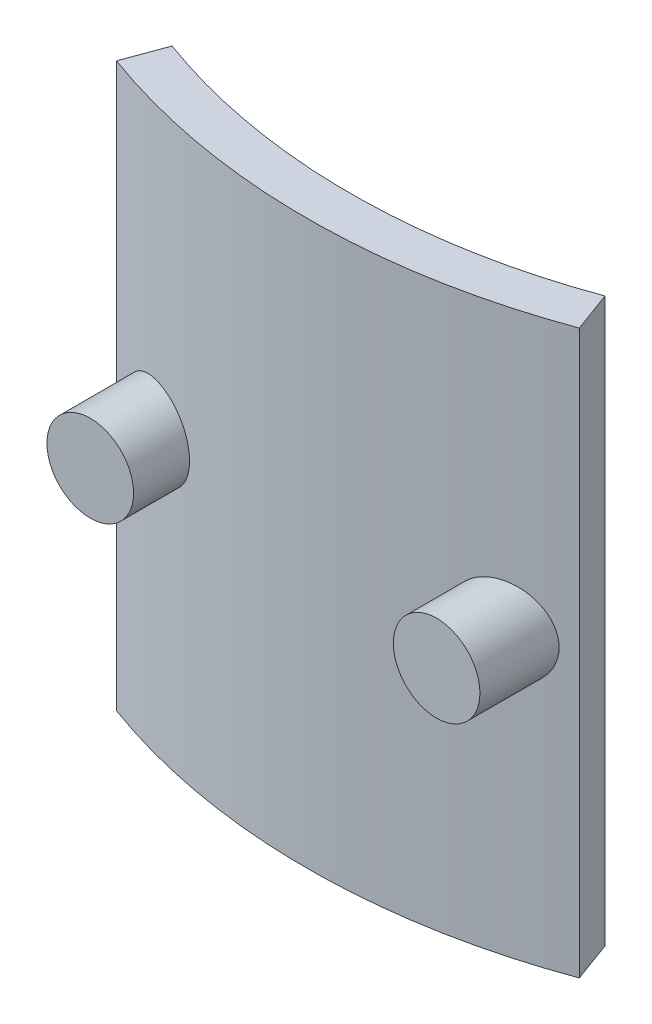
ISO-10303-21;
HEADER;
FILE_DESCRIPTION(('STEP AP214'),'2;1');
FILE_NAME('part.step','',(''),(''),'','','');
FILE_SCHEMA(('AUTOMOTIVE_DESIGN { 1 0 10303 214 1 1 1 1 }'));
ENDSEC;
DATA;
#1=APPLICATION_CONTEXT('core data for automotive mechanical design processes');
#2=APPLICATION_PROTOCOL_DEFINITION('international standard','automotive_design',2000,#1);
#3=PRODUCT_CONTEXT('',#1,'mechanical');
#4=PRODUCT('Part','Part','',(#3));
#5=PRODUCT_RELATED_PRODUCT_CATEGORY('part','',(#4));
#6=PRODUCT_DEFINITION_FORMATION('','',#4);
#7=PRODUCT_DEFINITION_CONTEXT('part definition',#1,'design');
#8=PRODUCT_DEFINITION('design','',#6,#7);
#9=PRODUCT_DEFINITION_SHAPE('','',#8);
#10=(LENGTH_UNIT() NAMED_UNIT(*) SI_UNIT(.MILLI.,.METRE.));
#11=(NAMED_UNIT(*) PLANE_ANGLE_UNIT() SI_UNIT($,.RADIAN.));
#12=(NAMED_UNIT(*) SI_UNIT($,.STERADIAN.) SOLID_ANGLE_UNIT());
#13=UNCERTAINTY_MEASURE_WITH_UNIT(LENGTH_MEASURE(1.E-05),#10,'distance_accuracy_value','');
#14=(GEOMETRIC_REPRESENTATION_CONTEXT(3) GLOBAL_UNCERTAINTY_ASSIGNED_CONTEXT((#13)) GLOBAL_UNIT_ASSIGNED_CONTEXT((#10,
#11,#12)) REPRESENTATION_CONTEXT('',''));
#15=CARTESIAN_POINT('',(0.,0.,0.));
#16=DIRECTION('',(0.,0.,1.));
#17=DIRECTION('',(1.,0.,0.));
#18=AXIS2_PLACEMENT_3D('',#15,#16,#17);
#19=CARTESIAN_POINT('',(0.,32.5,-72.5));
#20=DIRECTION('',(0.,-1.,0.));
#21=DIRECTION('',(0.,0.,-1.));
#22=AXIS2_PLACEMENT_3D('',#19,#20,#21);
#23=CYLINDRICAL_SURFACE('',#22,77.5);
#24=CARTESIAN_POINT('',(0.,-32.5,-72.5));
#25=DIRECTION('',(0.,1.,0.));
#26=DIRECTION('',(0.,0.,-1.));
#27=AXIS2_PLACEMENT_3D('',#24,#25,#26);
#28=CIRCLE('',#27,77.5);
#29=CARTESIAN_POINT('',(-26.7241379310345,-32.5,0.246618147121097));
#30=VERTEX_POINT('',#29);
#31=CARTESIAN_POINT('',(26.7241379310345,-32.5,0.246618147121083));
#32=VERTEX_POINT('',#31);
#33=EDGE_CURVE('E79',#30,#32,#28,.T.);
#34=ORIENTED_EDGE('',*,*,#33,.T.);
#35=DIRECTION('',(0.,-1.,0.));
#36=VECTOR('',#35,1.);
#37=CARTESIAN_POINT('',(26.7241379310345,32.5,0.246618147121083));
#38=LINE('',#37,#36);
#39=CARTESIAN_POINT('',(26.7241379310345,32.5,0.246618147121083));
#40=VERTEX_POINT('',#39);
#41=EDGE_CURVE('E107',#40,#32,#38,.T.);
#42=ORIENTED_EDGE('',*,*,#41,.F.);
#43=CARTESIAN_POINT('',(0.,32.5,-72.5));
#44=DIRECTION('',(0.,1.,0.));
#45=DIRECTION('',(0.,0.,-1.));
#46=AXIS2_PLACEMENT_3D('',#43,#44,#45);
#47=CIRCLE('',#46,77.5);
#48=CARTESIAN_POINT('',(-26.7241379310345,32.5,0.246618147121097));
#49=VERTEX_POINT('',#48);
#50=EDGE_CURVE('E96',#49,#40,#47,.T.);
#51=ORIENTED_EDGE('',*,*,#50,.F.);
#52=DIRECTION('',(0.,-1.,0.));
#53=VECTOR('',#52,1.);
#54=CARTESIAN_POINT('',(-26.7241379310345,32.5,0.246618147121097));
#55=LINE('',#54,#53);
#56=EDGE_CURVE('E102',#49,#30,#55,.T.);
#57=ORIENTED_EDGE('',*,*,#56,.T.);
#58=EDGE_LOOP('',(#34,#42,#51,#57));
#59=FACE_BOUND('',#58,.T.);
#60=CARTESIAN_POINT('',(-25.,0.,0.857003755606073));
#61=CARTESIAN_POINT('',(-25.0000012408049,-0.135252625132453,0.857003211021999));
#62=CARTESIAN_POINT('',(-24.9945087230892,-0.270488190350179,0.858875833438647));
#63=CARTESIAN_POINT('',(-24.9725916465428,-0.540011791240107,0.866339724952005));
#64=CARTESIAN_POINT('',(-24.9561641697617,-0.674299564328976,0.871931986619385));
#65=CARTESIAN_POINT('',(-24.9125106250282,-0.941020160222908,0.886765453114799));
#66=CARTESIAN_POINT('',(-24.8852751717758,-1.07345126700484,0.896009829290666));
#67=CARTESIAN_POINT('',(-24.82024913496,-1.33544846809279,0.918025104004591));
#68=CARTESIAN_POINT('',(-24.7824545675556,-1.46501346109477,0.930797333543373));
#69=CARTESIAN_POINT('',(-24.6967509575378,-1.72005524991855,0.959666007768892));
#70=CARTESIAN_POINT('',(-24.6488638633655,-1.84554024593692,0.975755237273817));
#71=CARTESIAN_POINT('',(-24.5433252888435,-2.09192830542884,1.011075895364));
#72=CARTESIAN_POINT('',(-24.4856702071338,-2.21282965876624,1.03030848278148));
#73=CARTESIAN_POINT('',(-24.3611221177703,-2.44917265412048,1.07166594168789));
#74=CARTESIAN_POINT('',(-24.2942340191346,-2.56461715394371,1.09378927589057));
#75=CARTESIAN_POINT('',(-24.151704526268,-2.78945812497952,1.14068711621359));
#76=CARTESIAN_POINT('',(-24.0760598247015,-2.89885228779843,1.16546262378207));
#77=CARTESIAN_POINT('',(-23.9145932797421,-3.11359095190591,1.21804126519764));
#78=CARTESIAN_POINT('',(-23.8285633180388,-3.2187643946932,1.24590487562253));
#79=CARTESIAN_POINT('',(-23.6485659215811,-3.4214568631518,1.30382301020202));
#80=CARTESIAN_POINT('',(-23.5545955989613,-3.51897307883914,1.33387833092041));
#81=CARTESIAN_POINT('',(-23.261795398066,-3.7991492705385,1.42686025362789));
#82=CARTESIAN_POINT('',(-23.0519496854026,-3.96960430509207,1.49264432604669));
#83=CARTESIAN_POINT('',(-22.598032076417,-4.28132812126077,1.6325705714127));
#84=CARTESIAN_POINT('',(-22.3527906608894,-4.42076995983216,1.70696382001012));
#85=CARTESIAN_POINT('',(-21.843090863087,-4.65637597000732,1.85859092369962));
#86=CARTESIAN_POINT('',(-21.5786285640638,-4.75253129199151,1.9358253561634));
#87=CARTESIAN_POINT('',(-21.0283761197109,-4.90167055617173,2.09317596301666));
#88=CARTESIAN_POINT('',(-20.7421689113301,-4.95310885659203,2.17330239056535));
#89=CARTESIAN_POINT('',(-20.16454750957,-5.00569957276501,2.33134821154762));
#90=CARTESIAN_POINT('',(-19.8731330584127,-5.00684949211774,2.40926749522299));
#91=CARTESIAN_POINT('',(-19.2923519385777,-4.95826895322651,2.56094550048348));
#92=CARTESIAN_POINT('',(-19.0029958830546,-4.90836194551541,2.63468884848188));
#93=CARTESIAN_POINT('',(-18.436031648493,-4.75814828424736,2.77581350257045));
#94=CARTESIAN_POINT('',(-18.1584223073509,-4.65784662893649,2.84319543881152));
#95=CARTESIAN_POINT('',(-17.6292571303561,-4.41168438136,2.96874715416472));
#96=CARTESIAN_POINT('',(-17.3772800586727,-4.26681284937828,3.02707914129293));
#97=CARTESIAN_POINT('',(-16.9010204780856,-3.9345379701315,3.135079193222));
#98=CARTESIAN_POINT('',(-16.67673359482,-3.74714135408232,3.184748627004));
#99=CARTESIAN_POINT('',(-16.2691654263119,-3.34085740784061,3.2733900321137));
#100=CARTESIAN_POINT('',(-16.084903811414,-3.12301060613984,3.31262482270069));
#101=CARTESIAN_POINT('',(-15.7555604558213,-2.65816372386,3.38175488644412));
#102=CARTESIAN_POINT('',(-15.6104735633668,-2.41116748278863,3.41165138773437));
#103=CARTESIAN_POINT('',(-15.3670914809103,-1.90110669230993,3.46129046976207));
#104=CARTESIAN_POINT('',(-15.2678104629131,-1.63853309534235,3.48124779303446));
#105=CARTESIAN_POINT('',(-15.1144702796128,-1.09998407410739,3.51190013480908));
#106=CARTESIAN_POINT('',(-15.0604074540257,-0.824009736505684,3.52259590301032));
#107=CARTESIAN_POINT('',(-14.9996431521848,-0.270256418864549,3.53460832431681));
#108=CARTESIAN_POINT('',(-14.9923489952359,0.00745514730484493,3.53604234950751));
#109=CARTESIAN_POINT('',(-15.0237729990046,0.560153843636413,3.52983949308688));
#110=CARTESIAN_POINT('',(-15.0624895615733,0.835141068092092,3.52220292653597));
#111=CARTESIAN_POINT('',(-15.1845038986508,1.37367404688867,3.49792530314415));
#112=CARTESIAN_POINT('',(-15.2676564981725,1.63725405498915,3.48131356673884));
#113=CARTESIAN_POINT('',(-15.475839744597,2.14654538372624,3.43918353252248));
#114=CARTESIAN_POINT('',(-15.6008706577504,2.39225659074594,3.41366517808561));
#115=CARTESIAN_POINT('',(-15.8897381011471,2.86038684004746,3.35372776155381));
#116=CARTESIAN_POINT('',(-16.0537859335319,3.08266919371609,3.3192601367133));
#117=CARTESIAN_POINT('',(-16.4152680096262,3.49645320145336,3.24181842932915));
#118=CARTESIAN_POINT('',(-16.6127040678534,3.68795318151808,3.19884388444645));
#119=CARTESIAN_POINT('',(-17.0382133356927,4.03792324745313,3.10421545460493));
#120=CARTESIAN_POINT('',(-17.2666983483091,4.19586001470751,3.05244204462165));
#121=CARTESIAN_POINT('',(-17.7452216665024,4.47126511805982,2.94148318713454));
#122=CARTESIAN_POINT('',(-17.9952622796116,4.58872911479572,2.88229694577747));
#123=CARTESIAN_POINT('',(-18.5159790744418,4.78296262355903,2.75610881861424));
#124=CARTESIAN_POINT('',(-18.7870054742614,4.85869322055031,2.68895403066273));
#125=CARTESIAN_POINT('',(-19.3366295307687,4.96369215222336,2.54948463935504));
#126=CARTESIAN_POINT('',(-19.615228342098,4.99295336036714,2.47716924634593));
#127=CARTESIAN_POINT('',(-20.1802091971157,5.00495721640669,2.32711378983185));
#128=CARTESIAN_POINT('',(-20.4665930476554,4.9863887061514,2.24927894564289));
#129=CARTESIAN_POINT('',(-21.0318008956494,4.90071479113567,2.09221997577527));
#130=CARTESIAN_POINT('',(-21.3106237984485,4.8336023968253,2.01299565163654));
#131=CARTESIAN_POINT('',(-21.7197473137362,4.69720637147237,1.89437791838178));
#132=CARTESIAN_POINT('',(-21.8558640114504,4.64510820695119,1.85449350388178));
#133=CARTESIAN_POINT('',(-22.123181183089,4.52916012155075,1.77539441851349));
#134=CARTESIAN_POINT('',(-22.2543834486706,4.46531453462642,1.73617950645847));
#135=CARTESIAN_POINT('',(-22.5109844266876,4.32623078027981,1.65877269550599));
#136=CARTESIAN_POINT('',(-22.6363807587035,4.25098799310092,1.62058121887104));
#137=CARTESIAN_POINT('',(-22.8803470787209,4.08961833823957,1.54563452203213));
#138=CARTESIAN_POINT('',(-22.9989198136797,4.00349589560016,1.5088787258118));
#139=CARTESIAN_POINT('',(-23.2276254588509,3.82147278680606,1.43741731678123));
#140=CARTESIAN_POINT('',(-23.3378085654436,3.72563986699339,1.40269985159406));
#141=CARTESIAN_POINT('',(-23.5496678139561,3.52437179699512,1.33546230961817));
#142=CARTESIAN_POINT('',(-23.6513475103743,3.418940697813,1.30294131579032));
#143=CARTESIAN_POINT('',(-23.8454504900397,3.19906653598908,1.24045629899677));
#144=CARTESIAN_POINT('',(-23.9378688764326,3.08461876236857,1.21049362995366));
#145=CARTESIAN_POINT('',(-24.1125303334074,2.8475876204436,1.15354247036479));
#146=CARTESIAN_POINT('',(-24.1947779933604,2.72500796016592,1.12655263898072));
#147=CARTESIAN_POINT('',(-24.3455221250375,2.47723231482609,1.07684159213265));
#148=CARTESIAN_POINT('',(-24.4144155589555,2.35230211468995,1.0539991602067));
#149=CARTESIAN_POINT('',(-24.5414366604348,2.0965978650251,1.01171585683752));
#150=CARTESIAN_POINT('',(-24.5995691375176,1.96582645877373,0.992273465989596));
#151=CARTESIAN_POINT('',(-24.7044793026861,1.69950881347675,0.957074295069395));
#152=CARTESIAN_POINT('',(-24.7512708127,1.56396861963418,0.941313029446714));
#153=CARTESIAN_POINT('',(-24.8331050512915,1.2890542154943,0.913682357783325));
#154=CARTESIAN_POINT('',(-24.8681517188486,1.14968130761349,0.90181164695973));
#155=CARTESIAN_POINT('',(-24.9312611702461,0.843342579008581,0.880402909943525));
#156=CARTESIAN_POINT('',(-24.9570077374475,0.675839229699985,0.87164363121982));
#157=CARTESIAN_POINT('',(-24.9913761305346,0.338881626250357,0.859944478274738));
#158=CARTESIAN_POINT('',(-24.9999984456761,0.169427427986036,0.857004437792306));
#159=CARTESIAN_POINT('',(-25.,0.,0.857003755606073));
#160=B_SPLINE_CURVE_WITH_KNOTS('',3,(#60,#61,#62,#63,#64,#65,#66,#67,#68,#69,#70,#71,#72,#73,
#74,#75,#76,#77,#78,#79,#80,#81,#82,#83,#84,#85,#86,#87,#88,#89,#90,#91,#92,#93,#94,#95,#96,#97,
#98,#99,#100,#101,#102,#103,#104,#105,#106,#107,#108,#109,#110,#111,#112,#113,#114,#115,#116,
#117,#118,#119,#120,#121,#122,#123,#124,#125,#126,#127,#128,#129,#130,#131,#132,#133,#134,#135,
#136,#137,#138,#139,#140,#141,#142,#143,#144,#145,#146,#147,#148,#149,#150,#151,#152,#153,#154,
#155,#156,#157,#158,#159),.UNSPECIFIED.,.T.,.F.,(4,2,2,2,2,2,2,2,2,2,2,2,2,2,2,2,2,2,2,2,2,2,2,
2,2,2,2,2,2,2,2,2,2,2,2,2,2,2,2,2,2,2,2,2,2,2,2,2,2,4),(0.,0.405604396196098,0.811317069728037,
1.21738282477711,1.62360199147433,2.0289466954784,2.43444117257928,2.83972088054658,
3.24515416364761,3.6607847408421,4.07656713663017,4.90749725125008,5.77891736050586,
6.65051554456939,7.55116272153882,8.45185460810068,9.3556715541026,10.2593988753486,
11.1443642905829,12.0291897238889,12.8889902111166,13.7486775732249,14.5888838511594,
15.4290221102008,16.2584922328262,17.0879335452527,17.9146814470757,18.7414346052293,
19.5727714318644,20.4041534528905,21.2478942645455,22.0917255112837,22.9557101157345,
23.8198272079342,24.7078828961014,25.5960664756723,26.0489371693911,26.5016411201445,
26.9545290640222,27.4072333959257,27.856972343862,28.3065223474772,28.7563088071306,
29.2058915617388,29.6387948189411,30.0715041239407,30.5036833775336,30.935717541666,
31.4438220834701,31.9519121080448),.UNSPECIFIED.);
#161=CARTESIAN_POINT('',(-25.,0.,0.857003755606073));
#162=VERTEX_POINT('',#161);
#163=EDGE_CURVE('E54',#162,#162,#160,.T.);
#164=ORIENTED_EDGE('',*,*,#163,.F.);
#165=EDGE_LOOP('',(#164));
#166=FACE_BOUND('',#165,.T.);
#167=CARTESIAN_POINT('',(15.,0.,3.53453162872776));
#168=CARTESIAN_POINT('',(14.9999988610372,-0.138322868000786,3.53453172963872));
#169=CARTESIAN_POINT('',(15.0057426386028,-0.276628337894224,3.53339937070697));
#170=CARTESIAN_POINT('',(15.0286723088931,-0.552295397962366,3.52887050175651));
#171=CARTESIAN_POINT('',(15.0458611645974,-0.689656734407243,3.5254734054269));
#172=CARTESIAN_POINT('',(15.0915683563441,-0.962524721518199,3.51641339510785));
#173=CARTESIAN_POINT('',(15.1200964509413,-1.09802967039588,3.51074852944484));
#174=CARTESIAN_POINT('',(15.1882674432878,-1.36615165317041,3.49715612704595));
#175=CARTESIAN_POINT('',(15.2279144242401,-1.49876760682063,3.48922775906192));
#176=CARTESIAN_POINT('',(15.3179534670919,-1.75997234839337,3.4711287645155));
#177=CARTESIAN_POINT('',(15.3683332746171,-1.88856553893481,3.46096069472248));
#178=CARTESIAN_POINT('',(15.4794887406951,-2.14102974336778,3.43838715414971));
#179=CARTESIAN_POINT('',(15.5402682179387,-2.26489900215805,3.42598086141782));
#180=CARTESIAN_POINT('',(15.6716945646719,-2.50693522303179,3.39896234383782));
#181=CARTESIAN_POINT('',(15.7423353834116,-2.62510562246357,3.38435147124092));
#182=CARTESIAN_POINT('',(15.8929930492108,-2.85506495633039,3.35294122558002));
#183=CARTESIAN_POINT('',(15.9730133716763,-2.96685150238175,3.33614104104662));
#184=CARTESIAN_POINT('',(16.1423110677762,-3.18391202797733,3.30028577121827));
#185=CARTESIAN_POINT('',(16.2316419929773,-3.28914206315232,3.28121754103527));
#186=CARTESIAN_POINT('',(16.4185010894299,-3.49168408811633,3.24095297106827));
#187=CARTESIAN_POINT('',(16.5160322520369,-3.58899316272742,3.21975585413679));
#188=CARTESIAN_POINT('',(16.7184975934085,-3.77500124177508,3.17531020165948));
#189=CARTESIAN_POINT('',(16.8234296542212,-3.86370269237297,3.15206225253679));
#190=CARTESIAN_POINT('',(17.0399817315629,-4.03201007995788,3.10358018541808));
#191=CARTESIAN_POINT('',(17.151604232393,-4.11161260602696,3.07834532853683));
#192=CARTESIAN_POINT('',(17.3827161526523,-4.26253523994648,3.02552861149296));
#193=CARTESIAN_POINT('',(17.5023097462613,-4.33368409374694,2.99791315234125));
#194=CARTESIAN_POINT('',(17.7467041071819,-4.46564148499217,2.94083940102175));
#195=CARTESIAN_POINT('',(17.8715067768081,-4.52644620295582,2.91138043362287));
#196=CARTESIAN_POINT('',(18.1253561413638,-4.63733541333515,2.85076952476919));
#197=CARTESIAN_POINT('',(18.2544016790923,-4.68742280127229,2.8196180434433));
#198=CARTESIAN_POINT('',(18.5158650719805,-4.77665788121943,2.75576999558152));
#199=CARTESIAN_POINT('',(18.6482841737461,-4.81580146335128,2.72307285395716));
#200=CARTESIAN_POINT('',(19.0561207112666,-4.91821355448094,2.62119335925874));
#201=CARTESIAN_POINT('',(19.3356815702474,-4.96365194821705,2.54975317431348));
#202=CARTESIAN_POINT('',(19.897256753549,-5.00688547108404,2.40282783229287));
#203=CARTESIAN_POINT('',(20.1792714494234,-5.00467325502973,2.32734205339141));
#204=CARTESIAN_POINT('',(20.7458504893629,-4.95244487959623,2.17227148605463));
#205=CARTESIAN_POINT('',(21.0302845610362,-4.90116426483849,2.09263108541531));
#206=CARTESIAN_POINT('',(21.5862102352804,-4.7504653898235,1.93365643226373));
#207=CARTESIAN_POINT('',(21.8577002295373,-4.65104116470966,1.85432221891521));
#208=CARTESIAN_POINT('',(22.3833687391245,-4.40508081341408,1.69778253804118));
#209=CARTESIAN_POINT('',(22.6373040532001,-4.25800049148821,1.62061342581374));
#210=CARTESIAN_POINT('',(23.1167736158861,-3.92066628125844,1.472480189855));
#211=CARTESIAN_POINT('',(23.3423090471384,-3.73041419165948,1.40151580778093));
#212=CARTESIAN_POINT('',(23.7540882576426,-3.31523500773459,1.27017874436837));
#213=CARTESIAN_POINT('',(23.9409563606572,-3.09098062966211,1.20964094635897));
#214=CARTESIAN_POINT('',(24.2738695028166,-2.61135538928811,1.10067969342299));
#215=CARTESIAN_POINT('',(24.4199264889956,-2.35599366484121,1.0522526936217));
#216=CARTESIAN_POINT('',(24.6600645955432,-1.83374829670594,0.972080331641991));
#217=CARTESIAN_POINT('',(24.7562008876844,-1.56791096754832,0.939678544994852));
#218=CARTESIAN_POINT('',(24.9024578543035,-1.02251589878464,0.890214910758276));
#219=CARTESIAN_POINT('',(24.9525934472799,-0.742962638402559,0.87314808991942));
#220=CARTESIAN_POINT('',(25.0036274894312,-0.191825432940502,0.855772007940681));
#221=CARTESIAN_POINT('',(25.0066714758071,0.0795388233664345,0.854732533650385));
#222=CARTESIAN_POINT('',(24.9689137347216,0.618816180889628,0.867593249259809));
#223=CARTESIAN_POINT('',(24.9281168344789,0.886729658776392,0.88149179436879));
#224=CARTESIAN_POINT('',(24.8050918114606,1.40775559988164,0.92316739780555));
#225=CARTESIAN_POINT('',(24.7234440717422,1.66102144571163,0.950749996655262));
#226=CARTESIAN_POINT('',(24.5218707494397,2.15003534498707,1.01829085295935));
#227=CARTESIAN_POINT('',(24.4019413290691,2.38578163915292,1.05825035120156));
#228=CARTESIAN_POINT('',(24.1240107546738,2.83994215902143,1.1498743726373));
#229=CARTESIAN_POINT('',(23.9650890160462,3.05773537823435,1.20181977923486));
#230=CARTESIAN_POINT('',(23.6157814062813,3.46379846421318,1.31448701380471));
#231=CARTESIAN_POINT('',(23.4253886010853,3.65206180676935,1.3752107755521));
#232=CARTESIAN_POINT('',(23.0086229651858,4.00324064992581,1.50610198898529));
#233=CARTESIAN_POINT('',(22.780965807172,4.1645155925804,1.57658200245819));
#234=CARTESIAN_POINT('',(22.3030925016298,4.44666035050601,1.72185927861741));
#235=CARTESIAN_POINT('',(22.0528713674793,4.56752120637067,1.79665749430268));
#236=CARTESIAN_POINT('',(21.5259683882039,4.77014618207851,1.95106464169921));
#237=CARTESIAN_POINT('',(21.2486265272555,4.85013817536811,2.03074596026523));
#238=CARTESIAN_POINT('',(20.6839504343135,4.96134215460745,2.18942355216254));
#239=CARTESIAN_POINT('',(20.3966151461081,4.99254896830668,2.2684197519741));
#240=CARTESIAN_POINT('',(19.9626033848409,5.00199952438798,2.38502882716532));
#241=CARTESIAN_POINT('',(19.8164313340136,4.99877124559549,2.42384049329196));
#242=CARTESIAN_POINT('',(19.5246709541934,4.97949783429706,2.5003992773508));
#243=CARTESIAN_POINT('',(19.3790824252556,4.96345755200394,2.53814679253886));
#244=CARTESIAN_POINT('',(19.0895052590796,4.91858557329291,2.61233692827173));
#245=CARTESIAN_POINT('',(18.9455172104669,4.8897493205693,2.64877907901123));
#246=CARTESIAN_POINT('',(18.6603299803034,4.81942326689056,2.7201015348747));
#247=CARTESIAN_POINT('',(18.5191296837463,4.77793863868589,2.75498247180622));
#248=CARTESIAN_POINT('',(18.242601035565,4.68322496165177,2.82248980999751));
#249=CARTESIAN_POINT('',(18.1072169861869,4.63017671182547,2.85514173872067));
#250=CARTESIAN_POINT('',(17.8412724823159,4.51232089099919,2.91854994831005));
#251=CARTESIAN_POINT('',(17.7107100747004,4.44751814574692,2.94930700019192));
#252=CARTESIAN_POINT('',(17.4553593583011,4.30651608285156,3.00879169178483));
#253=CARTESIAN_POINT('',(17.3305725065477,4.2303139097126,3.03751882034865));
#254=CARTESIAN_POINT('',(17.0878766880029,4.06705257676035,3.09279036693486));
#255=CARTESIAN_POINT('',(16.9699648714915,3.97999796294763,3.11933569121699));
#256=CARTESIAN_POINT('',(16.7450882288924,3.79814183303127,3.1694451370488));
#257=CARTESIAN_POINT('',(16.6379114750848,3.70361935001037,3.19307118596722));
#258=CARTESIAN_POINT('',(16.4318465673898,3.50552390105911,3.23807192209133));
#259=CARTESIAN_POINT('',(16.3329549940242,3.4019547053184,3.25944753904443));
#260=CARTESIAN_POINT('',(16.1441719459393,3.18639720761444,3.2999013172815));
#261=CARTESIAN_POINT('',(16.0542853102529,3.07440443501984,3.31897824441059));
#262=CARTESIAN_POINT('',(15.8843541744234,2.8428978765024,3.35476143345451));
#263=CARTESIAN_POINT('',(15.8043057126244,2.72338714742907,3.37146865002951));
#264=CARTESIAN_POINT('',(15.6565060431811,2.48067629876623,3.40210390785987));
#265=CARTESIAN_POINT('',(15.5885029197423,2.35763680872728,3.4160897019528));
#266=CARTESIAN_POINT('',(15.4630419124439,2.10612283004867,3.44174369341636));
#267=CARTESIAN_POINT('',(15.4055798300023,1.97765053054113,3.4534128136899));
#268=CARTESIAN_POINT('',(15.3016866142548,1.7162773360871,3.47441145664365));
#269=CARTESIAN_POINT('',(15.2552448751554,1.58338084055505,3.4837432292324));
#270=CARTESIAN_POINT('',(15.1737130905282,1.31405843856338,3.50006682014855));
#271=CARTESIAN_POINT('',(15.1386199347181,1.17763351022264,3.50705927962474));
#272=CARTESIAN_POINT('',(15.0730494640159,0.869245259242008,3.52009320149569));
#273=CARTESIAN_POINT('',(15.0456826566787,0.696584826356679,3.52550740424611));
#274=CARTESIAN_POINT('',(15.0091587223918,0.349273674860522,3.53272653854887));
#275=CARTESIAN_POINT('',(15.0000014378611,0.174622973486161,3.53453150133471));
#276=CARTESIAN_POINT('',(15.,0.,3.53453162872776));
#277=B_SPLINE_CURVE_WITH_KNOTS('',3,(#167,#168,#169,#170,#171,#172,#173,#174,#175,#176,#177,
#178,#179,#180,#181,#182,#183,#184,#185,#186,#187,#188,#189,#190,#191,#192,#193,#194,#195,#196,
#197,#198,#199,#200,#201,#202,#203,#204,#205,#206,#207,#208,#209,#210,#211,#212,#213,#214,#215,
#216,#217,#218,#219,#220,#221,#222,#223,#224,#225,#226,#227,#228,#229,#230,#231,#232,#233,#234,
#235,#236,#237,#238,#239,#240,#241,#242,#243,#244,#245,#246,#247,#248,#249,#250,#251,#252,#253,
#254,#255,#256,#257,#258,#259,#260,#261,#262,#263,#264,#265,#266,#267,#268,#269,#270,#271,#272,
#273,#274,#275,#276),.UNSPECIFIED.,.T.,.F.,(4,2,2,2,2,2,2,2,2,2,2,2,2,2,2,2,2,2,2,2,2,2,2,2,2,2,
2,2,2,2,2,2,2,2,2,2,2,2,2,2,2,2,2,2,2,2,2,2,2,2,2,2,2,2,4),(0.,0.414814933054206,
0.829737297993405,1.24501752116552,1.66045044837667,2.07541156654219,2.49052538399536,
2.90538560519356,3.32040003420775,3.73794911417736,4.15565117781424,4.57323418682909,
4.99097322552091,5.41609557701148,5.84137456208001,6.2665385032322,6.69186189823892,
7.56381505533045,8.4359026221022,9.33108595975171,10.2263802364638,11.1322813721767,
12.038144771428,12.9279882893542,13.8175710411906,14.6668468050716,15.5158470426613,
16.3260459271805,17.1361556117142,17.935069358385,18.7340632223326,19.554127287744,
20.3743722803138,21.2338018845499,22.0934218897737,22.9876887911427,23.8820504970989,
24.3354125020833,24.7886029600796,25.2419549168272,25.6951217163476,26.1416552274301,
26.5880058296945,27.0344684282076,27.4807446316064,27.9147426069199,28.3485605700528,
28.7826104197366,29.2164849086563,29.6397976432653,30.0629414011444,30.4856762658468,
30.9082951741106,31.4319746275325,31.9556495491368),.UNSPECIFIED.);
#278=CARTESIAN_POINT('',(15.,0.,3.53453162872776));
#279=VERTEX_POINT('',#278);
#280=EDGE_CURVE('E11',#279,#279,#277,.T.);
#281=ORIENTED_EDGE('',*,*,#280,.F.);
#282=EDGE_LOOP('',(#281));
#283=FACE_BOUND('',#282,.T.);
#284=ADVANCED_FACE('F39',(#59,#166,#283),#23,.T.);
#285=CARTESIAN_POINT('',(0.,32.5,-72.5));
#286=DIRECTION('',(0.,-1.,0.));
#287=DIRECTION('',(0.,0.,-1.));
#288=AXIS2_PLACEMENT_3D('',#285,#286,#287);
#289=CYLINDRICAL_SURFACE('',#288,72.5);
#290=CARTESIAN_POINT('',(0.,-32.5,-72.5));
#291=DIRECTION('',(0.,-1.,0.));
#292=DIRECTION('',(0.,0.,-1.));
#293=AXIS2_PLACEMENT_3D('',#290,#291,#292);
#294=CIRCLE('',#293,72.5);
#295=CARTESIAN_POINT('',(25.,-32.5,-4.446712055919));
#296=VERTEX_POINT('',#295);
#297=CARTESIAN_POINT('',(-25.,-32.5,-4.446712055919));
#298=VERTEX_POINT('',#297);
#299=EDGE_CURVE('E117',#296,#298,#294,.T.);
#300=ORIENTED_EDGE('',*,*,#299,.T.);
#301=DIRECTION('',(0.,-1.,0.));
#302=VECTOR('',#301,1.);
#303=CARTESIAN_POINT('',(-25.,32.5,-4.446712055919));
#304=LINE('',#303,#302);
#305=CARTESIAN_POINT('',(-25.,32.5,-4.446712055919));
#306=VERTEX_POINT('',#305);
#307=EDGE_CURVE('E106',#306,#298,#304,.T.);
#308=ORIENTED_EDGE('',*,*,#307,.F.);
#309=CARTESIAN_POINT('',(0.,32.5,-72.5));
#310=DIRECTION('',(0.,-1.,0.));
#311=DIRECTION('',(0.,0.,-1.));
#312=AXIS2_PLACEMENT_3D('',#309,#310,#311);
#313=CIRCLE('',#312,72.5);
#314=CARTESIAN_POINT('',(25.,32.5,-4.446712055919));
#315=VERTEX_POINT('',#314);
#316=EDGE_CURVE('E98',#315,#306,#313,.T.);
#317=ORIENTED_EDGE('',*,*,#316,.F.);
#318=DIRECTION('',(0.,-1.,0.));
#319=VECTOR('',#318,1.);
#320=CARTESIAN_POINT('',(25.,32.5,-4.446712055919));
#321=LINE('',#320,#319);
#322=EDGE_CURVE('E113',#315,#296,#321,.T.);
#323=ORIENTED_EDGE('',*,*,#322,.T.);
#324=EDGE_LOOP('',(#300,#308,#317,#323));
#325=FACE_BOUND('',#324,.T.);
#326=ADVANCED_FACE('F41',(#325),#289,.F.);
#327=CARTESIAN_POINT('',(-25.,32.5,-4.446712055919));
#328=DIRECTION('',(0.938666040608013,0.,0.344827586206899));
#329=DIRECTION('',(0.344827586206899,0.,-0.938666040608013));
#330=AXIS2_PLACEMENT_3D('',#327,#328,#329);
#331=PLANE('',#330);
#332=DIRECTION('',(-0.344827586206898,0.,0.938666040608013));
#333=VECTOR('',#332,1.);
#334=CARTESIAN_POINT('',(-25.,-32.5,-4.446712055919));
#335=LINE('',#334,#333);
#336=EDGE_CURVE('E104',#298,#30,#335,.T.);
#337=ORIENTED_EDGE('',*,*,#336,.T.);
#338=ORIENTED_EDGE('',*,*,#56,.F.);
#339=DIRECTION('',(-0.344827586206898,0.,0.938666040608013));
#340=VECTOR('',#339,1.);
#341=CARTESIAN_POINT('',(-25.,32.5,-4.446712055919));
#342=LINE('',#341,#340);
#343=EDGE_CURVE('E93',#306,#49,#342,.T.);
#344=ORIENTED_EDGE('',*,*,#343,.F.);
#345=ORIENTED_EDGE('',*,*,#307,.T.);
#346=EDGE_LOOP('',(#337,#338,#344,#345));
#347=FACE_BOUND('',#346,.T.);
#348=ADVANCED_FACE('F103',(#347),#331,.F.);
#349=CARTESIAN_POINT('',(25.,32.5,-4.446712055919));
#350=DIRECTION('',(-0.938666040608015,0.,0.344827586206893));
#351=DIRECTION('',(0.344827586206893,0.,0.938666040608015));
#352=AXIS2_PLACEMENT_3D('',#349,#350,#351);
#353=PLANE('',#352);
#354=DIRECTION('',(-0.344827586206893,0.,-0.938666040608015));
#355=VECTOR('',#354,1.);
#356=CARTESIAN_POINT('',(25.,-32.5,-4.446712055919));
#357=LINE('',#356,#355);
#358=EDGE_CURVE('E85',#32,#296,#357,.T.);
#359=ORIENTED_EDGE('',*,*,#358,.T.);
#360=ORIENTED_EDGE('',*,*,#322,.F.);
#361=DIRECTION('',(-0.344827586206893,0.,-0.938666040608015));
#362=VECTOR('',#361,1.);
#363=CARTESIAN_POINT('',(25.,32.5,-4.446712055919));
#364=LINE('',#363,#362);
#365=EDGE_CURVE('E62',#40,#315,#364,.T.);
#366=ORIENTED_EDGE('',*,*,#365,.F.);
#367=ORIENTED_EDGE('',*,*,#41,.T.);
#368=EDGE_LOOP('',(#359,#360,#366,#367));
#369=FACE_BOUND('',#368,.T.);
#370=ADVANCED_FACE('F151',(#369),#353,.F.);
#371=CARTESIAN_POINT('',(0.,32.5,-72.5));
#372=DIRECTION('',(0.,-1.,0.));
#373=DIRECTION('',(0.,0.,-1.));
#374=AXIS2_PLACEMENT_3D('',#371,#372,#373);
#375=PLANE('',#374);
#376=ORIENTED_EDGE('',*,*,#316,.T.);
#377=ORIENTED_EDGE('',*,*,#343,.T.);
#378=ORIENTED_EDGE('',*,*,#50,.T.);
#379=ORIENTED_EDGE('',*,*,#365,.T.);
#380=EDGE_LOOP('',(#376,#377,#378,#379));
#381=FACE_BOUND('',#380,.T.);
#382=ADVANCED_FACE('F94',(#381),#375,.F.);
#383=CARTESIAN_POINT('',(0.,-32.5,-72.5));
#384=DIRECTION('',(0.,-1.,0.));
#385=DIRECTION('',(0.,0.,-1.));
#386=AXIS2_PLACEMENT_3D('',#383,#384,#385);
#387=PLANE('',#386);
#388=ORIENTED_EDGE('',*,*,#299,.F.);
#389=ORIENTED_EDGE('',*,*,#358,.F.);
#390=ORIENTED_EDGE('',*,*,#33,.F.);
#391=ORIENTED_EDGE('',*,*,#336,.F.);
#392=EDGE_LOOP('',(#388,#389,#390,#391));
#393=FACE_BOUND('',#392,.T.);
#394=ADVANCED_FACE('F147',(#393),#387,.T.);
#395=CARTESIAN_POINT('',(-20.,0.,10.));
#396=DIRECTION('',(0.,0.,-1.));
#397=DIRECTION('',(-1.,0.,0.));
#398=AXIS2_PLACEMENT_3D('',#395,#396,#397);
#399=CYLINDRICAL_SURFACE('',#398,5.);
#400=CARTESIAN_POINT('',(-20.,0.,10.));
#401=DIRECTION('',(0.,0.,1.));
#402=DIRECTION('',(1.,0.,0.));
#403=AXIS2_PLACEMENT_3D('',#400,#401,#402);
#404=CIRCLE('',#403,5.);
#405=CARTESIAN_POINT('',(-15.,0.,10.));
#406=VERTEX_POINT('',#405);
#407=EDGE_CURVE('E121',#406,#406,#404,.T.);
#408=ORIENTED_EDGE('',*,*,#407,.F.);
#409=EDGE_LOOP('',(#408));
#410=FACE_BOUND('',#409,.T.);
#411=ORIENTED_EDGE('',*,*,#163,.T.);
#412=EDGE_LOOP('',(#411));
#413=FACE_BOUND('',#412,.T.);
#414=ADVANCED_FACE('F141',(#410,#413),#399,.T.);
#415=CARTESIAN_POINT('',(-20.,0.,10.));
#416=DIRECTION('',(0.,0.,1.));
#417=DIRECTION('',(1.,0.,0.));
#418=AXIS2_PLACEMENT_3D('',#415,#416,#417);
#419=PLANE('',#418);
#420=ORIENTED_EDGE('',*,*,#407,.T.);
#421=EDGE_LOOP('',(#420));
#422=FACE_BOUND('',#421,.T.);
#423=ADVANCED_FACE('F146',(#422),#419,.T.);
#424=CARTESIAN_POINT('',(20.,0.,10.));
#425=DIRECTION('',(0.,0.,-1.));
#426=DIRECTION('',(-1.,0.,0.));
#427=AXIS2_PLACEMENT_3D('',#424,#425,#426);
#428=CYLINDRICAL_SURFACE('',#427,5.);
#429=CARTESIAN_POINT('',(20.,0.,10.));
#430=DIRECTION('',(0.,0.,1.));
#431=DIRECTION('',(1.,0.,0.));
#432=AXIS2_PLACEMENT_3D('',#429,#430,#431);
#433=CIRCLE('',#432,5.);
#434=CARTESIAN_POINT('',(25.,0.,10.));
#435=VERTEX_POINT('',#434);
#436=EDGE_CURVE('E171',#435,#435,#433,.T.);
#437=ORIENTED_EDGE('',*,*,#436,.F.);
#438=EDGE_LOOP('',(#437));
#439=FACE_BOUND('',#438,.T.);
#440=ORIENTED_EDGE('',*,*,#280,.T.);
#441=EDGE_LOOP('',(#440));
#442=FACE_BOUND('',#441,.T.);
#443=ADVANCED_FACE('F178',(#439,#442),#428,.T.);
#444=CARTESIAN_POINT('',(20.,0.,10.));
#445=DIRECTION('',(0.,0.,1.));
#446=DIRECTION('',(1.,0.,0.));
#447=AXIS2_PLACEMENT_3D('',#444,#445,#446);
#448=PLANE('',#447);
#449=ORIENTED_EDGE('',*,*,#436,.T.);
#450=EDGE_LOOP('',(#449));
#451=FACE_BOUND('',#450,.T.);
#452=ADVANCED_FACE('F176',(#451),#448,.T.);
#453=CLOSED_SHELL('',(#284,#326,#348,#370,#382,#394,#414,#423,#443,#452));
#454=MANIFOLD_SOLID_BREP('B2',#453);
#455=ADVANCED_BREP_SHAPE_REPRESENTATION('',(#18,#454),#14);
#456=SHAPE_DEFINITION_REPRESENTATION(#9,#455);
ENDSEC;
END-ISO-10303-21;
